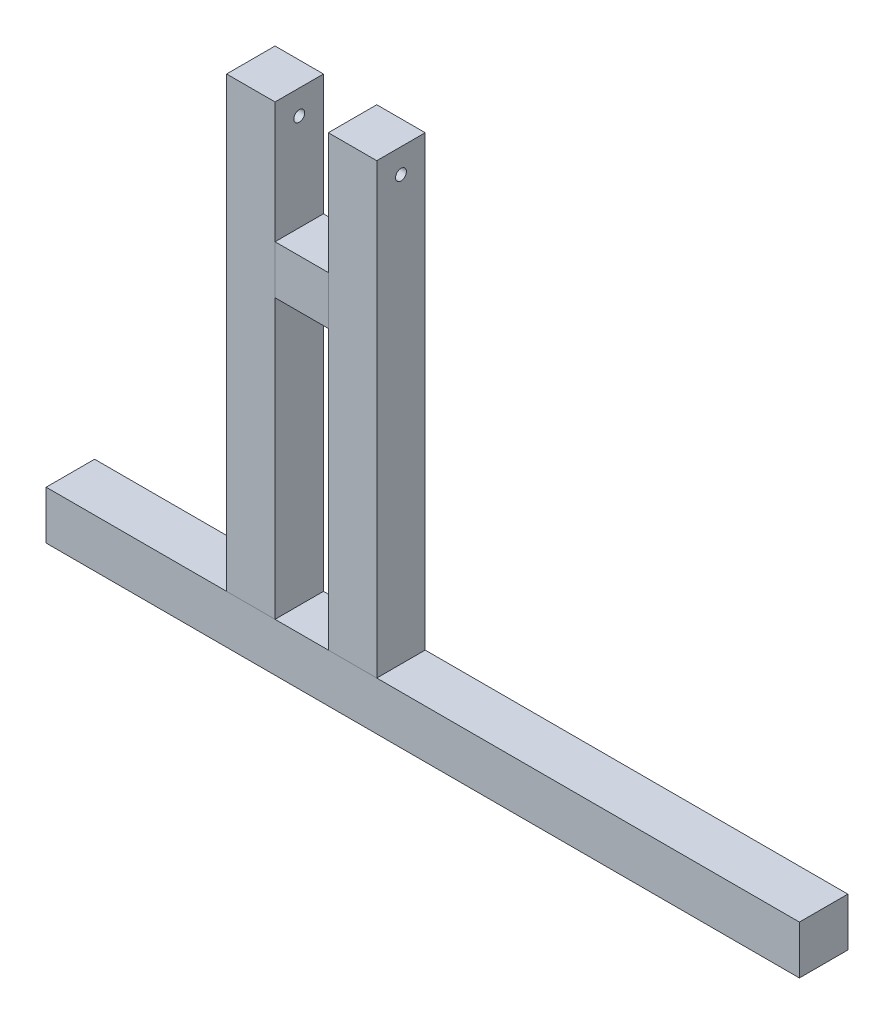
ISO-10303-21;
HEADER;
FILE_DESCRIPTION(('STEP AP214'),'2;1');
FILE_NAME('part.step','',(''),(''),'','','');
FILE_SCHEMA(('AUTOMOTIVE_DESIGN { 1 0 10303 214 1 1 1 1 }'));
ENDSEC;
DATA;
#1=APPLICATION_CONTEXT('core data for automotive mechanical design processes');
#2=APPLICATION_PROTOCOL_DEFINITION('international standard','automotive_design',2000,#1);
#3=PRODUCT_CONTEXT('',#1,'mechanical');
#4=PRODUCT('Part','Part','',(#3));
#5=PRODUCT_RELATED_PRODUCT_CATEGORY('part','',(#4));
#6=PRODUCT_DEFINITION_FORMATION('','',#4);
#7=PRODUCT_DEFINITION_CONTEXT('part definition',#1,'design');
#8=PRODUCT_DEFINITION('design','',#6,#7);
#9=PRODUCT_DEFINITION_SHAPE('','',#8);
#10=(LENGTH_UNIT() NAMED_UNIT(*) SI_UNIT(.MILLI.,.METRE.));
#11=(NAMED_UNIT(*) PLANE_ANGLE_UNIT() SI_UNIT($,.RADIAN.));
#12=(NAMED_UNIT(*) SI_UNIT($,.STERADIAN.) SOLID_ANGLE_UNIT());
#13=UNCERTAINTY_MEASURE_WITH_UNIT(LENGTH_MEASURE(1.E-05),#10,'distance_accuracy_value','');
#14=(GEOMETRIC_REPRESENTATION_CONTEXT(3) GLOBAL_UNCERTAINTY_ASSIGNED_CONTEXT((#13)) GLOBAL_UNIT_ASSIGNED_CONTEXT((#10,
#11,#12)) REPRESENTATION_CONTEXT('',''));
#15=CARTESIAN_POINT('',(0.,0.,0.));
#16=DIRECTION('',(0.,0.,1.));
#17=DIRECTION('',(1.,0.,0.));
#18=AXIS2_PLACEMENT_3D('',#15,#16,#17);
#19=CARTESIAN_POINT('',(-211.,-0.01000000000001,-20.01));
#20=DIRECTION('',(-1.,0.,0.));
#21=DIRECTION('',(0.,0.,1.));
#22=AXIS2_PLACEMENT_3D('',#19,#20,#21);
#23=PLANE('',#22);
#24=DIRECTION('',(0.,0.,1.));
#25=VECTOR('',#24,1.);
#26=CARTESIAN_POINT('',(-211.,40.,0.));
#27=LINE('',#26,#25);
#28=CARTESIAN_POINT('',(-211.,40.,-20.));
#29=VERTEX_POINT('',#28);
#30=CARTESIAN_POINT('',(-211.,40.,20.));
#31=VERTEX_POINT('',#30);
#32=EDGE_CURVE('P0_E69',#29,#31,#27,.T.);
#33=ORIENTED_EDGE('',*,*,#32,.F.);
#34=DIRECTION('',(0.,1.,0.));
#35=VECTOR('',#34,1.);
#36=CARTESIAN_POINT('',(-211.,20.,-20.));
#37=LINE('',#36,#35);
#38=CARTESIAN_POINT('',(-211.,0.,-20.));
#39=VERTEX_POINT('',#38);
#40=EDGE_CURVE('P0_E56',#39,#29,#37,.T.);
#41=ORIENTED_EDGE('',*,*,#40,.F.);
#42=DIRECTION('',(0.,0.,-1.));
#43=VECTOR('',#42,1.);
#44=CARTESIAN_POINT('',(-211.,0.,0.));
#45=LINE('',#44,#43);
#46=CARTESIAN_POINT('',(-211.,0.,20.));
#47=VERTEX_POINT('',#46);
#48=EDGE_CURVE('P0_E21',#47,#39,#45,.T.);
#49=ORIENTED_EDGE('',*,*,#48,.F.);
#50=DIRECTION('',(0.,-1.,0.));
#51=VECTOR('',#50,1.);
#52=CARTESIAN_POINT('',(-211.,20.,20.));
#53=LINE('',#52,#51);
#54=EDGE_CURVE('P0_E82',#31,#47,#53,.T.);
#55=ORIENTED_EDGE('',*,*,#54,.F.);
#56=EDGE_LOOP('',(#33,#41,#49,#55));
#57=FACE_BOUND('',#56,.T.);
#58=ADVANCED_FACE('P0_F17',(#57),#23,.T.);
#59=CARTESIAN_POINT('',(-211.01,0.,20.01));
#60=DIRECTION('',(0.,-1.,0.));
#61=DIRECTION('',(0.,0.,-1.));
#62=AXIS2_PLACEMENT_3D('',#59,#60,#61);
#63=PLANE('',#62);
#64=DIRECTION('',(1.,0.,0.));
#65=VECTOR('',#64,1.);
#66=CARTESIAN_POINT('',(100.,0.,20.));
#67=LINE('',#66,#65);
#68=CARTESIAN_POINT('',(411.,0.,20.));
#69=VERTEX_POINT('',#68);
#70=EDGE_CURVE('P0_E65',#47,#69,#67,.T.);
#71=ORIENTED_EDGE('',*,*,#70,.F.);
#72=ORIENTED_EDGE('',*,*,#48,.T.);
#73=DIRECTION('',(-1.,0.,0.));
#74=VECTOR('',#73,1.);
#75=CARTESIAN_POINT('',(100.,0.,-20.));
#76=LINE('',#75,#74);
#77=CARTESIAN_POINT('',(411.,0.,-20.));
#78=VERTEX_POINT('',#77);
#79=EDGE_CURVE('P0_E62',#78,#39,#76,.T.);
#80=ORIENTED_EDGE('',*,*,#79,.F.);
#81=DIRECTION('',(0.,0.,-1.));
#82=VECTOR('',#81,1.);
#83=CARTESIAN_POINT('',(411.,0.,0.));
#84=LINE('',#83,#82);
#85=EDGE_CURVE('P0_E84',#69,#78,#84,.T.);
#86=ORIENTED_EDGE('',*,*,#85,.F.);
#87=EDGE_LOOP('',(#71,#72,#80,#86));
#88=FACE_BOUND('',#87,.T.);
#89=ADVANCED_FACE('P0_F61',(#88),#63,.T.);
#90=CARTESIAN_POINT('',(-211.01,-0.0100000000000111,-20.));
#91=DIRECTION('',(0.,0.,-1.));
#92=DIRECTION('',(0.,1.,0.));
#93=AXIS2_PLACEMENT_3D('',#90,#91,#92);
#94=PLANE('',#93);
#95=ORIENTED_EDGE('',*,*,#79,.T.);
#96=ORIENTED_EDGE('',*,*,#40,.T.);
#97=DIRECTION('',(-1.,0.,0.));
#98=VECTOR('',#97,1.);
#99=CARTESIAN_POINT('',(100.,40.,-20.));
#100=LINE('',#99,#98);
#101=CARTESIAN_POINT('',(411.,40.,-20.));
#102=VERTEX_POINT('',#101);
#103=EDGE_CURVE('P0_E71',#102,#29,#100,.T.);
#104=ORIENTED_EDGE('',*,*,#103,.F.);
#105=DIRECTION('',(0.,1.,0.));
#106=VECTOR('',#105,1.);
#107=CARTESIAN_POINT('',(411.,20.,-20.));
#108=LINE('',#107,#106);
#109=EDGE_CURVE('P0_E75',#78,#102,#108,.T.);
#110=ORIENTED_EDGE('',*,*,#109,.F.);
#111=EDGE_LOOP('',(#95,#96,#104,#110));
#112=FACE_BOUND('',#111,.T.);
#113=ADVANCED_FACE('P0_F73',(#112),#94,.T.);
#114=CARTESIAN_POINT('',(-211.01,40.,-20.01));
#115=DIRECTION('',(0.,1.,0.));
#116=DIRECTION('',(0.,0.,1.));
#117=AXIS2_PLACEMENT_3D('',#114,#115,#116);
#118=PLANE('',#117);
#119=ORIENTED_EDGE('',*,*,#103,.T.);
#120=ORIENTED_EDGE('',*,*,#32,.T.);
#121=DIRECTION('',(-1.,0.,0.));
#122=VECTOR('',#121,1.);
#123=CARTESIAN_POINT('',(100.,40.,20.));
#124=LINE('',#123,#122);
#125=CARTESIAN_POINT('',(411.,40.,20.));
#126=VERTEX_POINT('',#125);
#127=EDGE_CURVE('P0_E36',#126,#31,#124,.T.);
#128=ORIENTED_EDGE('',*,*,#127,.F.);
#129=DIRECTION('',(0.,0.,1.));
#130=VECTOR('',#129,1.);
#131=CARTESIAN_POINT('',(411.,40.,0.));
#132=LINE('',#131,#130);
#133=EDGE_CURVE('P0_E27',#102,#126,#132,.T.);
#134=ORIENTED_EDGE('',*,*,#133,.F.);
#135=EDGE_LOOP('',(#119,#120,#128,#134));
#136=FACE_BOUND('',#135,.T.);
#137=ADVANCED_FACE('P0_F89',(#136),#118,.T.);
#138=CARTESIAN_POINT('',(-211.01,40.01,20.));
#139=DIRECTION('',(0.,0.,1.));
#140=DIRECTION('',(0.,-1.,0.));
#141=AXIS2_PLACEMENT_3D('',#138,#139,#140);
#142=PLANE('',#141);
#143=ORIENTED_EDGE('',*,*,#127,.T.);
#144=ORIENTED_EDGE('',*,*,#54,.T.);
#145=ORIENTED_EDGE('',*,*,#70,.T.);
#146=DIRECTION('',(0.,-1.,0.));
#147=VECTOR('',#146,1.);
#148=CARTESIAN_POINT('',(411.,20.,20.));
#149=LINE('',#148,#147);
#150=EDGE_CURVE('P0_E11',#126,#69,#149,.T.);
#151=ORIENTED_EDGE('',*,*,#150,.F.);
#152=EDGE_LOOP('',(#143,#144,#145,#151));
#153=FACE_BOUND('',#152,.T.);
#154=ADVANCED_FACE('P0_F91',(#153),#142,.T.);
#155=CARTESIAN_POINT('',(411.,-0.01000000000001,20.01));
#156=DIRECTION('',(1.,0.,0.));
#157=DIRECTION('',(0.,0.,-1.));
#158=AXIS2_PLACEMENT_3D('',#155,#156,#157);
#159=PLANE('',#158);
#160=ORIENTED_EDGE('',*,*,#133,.T.);
#161=ORIENTED_EDGE('',*,*,#150,.T.);
#162=ORIENTED_EDGE('',*,*,#85,.T.);
#163=ORIENTED_EDGE('',*,*,#109,.T.);
#164=EDGE_LOOP('',(#160,#161,#162,#163));
#165=FACE_BOUND('',#164,.T.);
#166=ADVANCED_FACE('P0_F19',(#165),#159,.T.);
#167=CLOSED_SHELL('',(#58,#89,#113,#137,#154,#166));
#168=MANIFOLD_SOLID_BREP('P0_B1',#167);
#169=CARTESIAN_POINT('',(21.99,40.,-20.01));
#170=DIRECTION('',(0.,-1.,0.));
#171=DIRECTION('',(1.,0.,0.));
#172=AXIS2_PLACEMENT_3D('',#169,#170,#171);
#173=PLANE('',#172);
#174=DIRECTION('',(-1.,0.,0.));
#175=VECTOR('',#174,1.);
#176=CARTESIAN_POINT('',(42.,40.,-20.));
#177=LINE('',#176,#175);
#178=CARTESIAN_POINT('',(62.,40.,-20.));
#179=VERTEX_POINT('',#178);
#180=CARTESIAN_POINT('',(22.,40.,-20.));
#181=VERTEX_POINT('',#180);
#182=EDGE_CURVE('P1_E57',#179,#181,#177,.T.);
#183=ORIENTED_EDGE('',*,*,#182,.F.);
#184=DIRECTION('',(0.,0.,-1.));
#185=VECTOR('',#184,1.);
#186=CARTESIAN_POINT('',(62.,40.,0.));
#187=LINE('',#186,#185);
#188=CARTESIAN_POINT('',(62.,40.,20.));
#189=VERTEX_POINT('',#188);
#190=EDGE_CURVE('P1_E54',#189,#179,#187,.T.);
#191=ORIENTED_EDGE('',*,*,#190,.F.);
#192=DIRECTION('',(1.,0.,0.));
#193=VECTOR('',#192,1.);
#194=CARTESIAN_POINT('',(42.,40.,20.));
#195=LINE('',#194,#193);
#196=CARTESIAN_POINT('',(22.,40.,20.));
#197=VERTEX_POINT('',#196);
#198=EDGE_CURVE('P1_E81',#197,#189,#195,.T.);
#199=ORIENTED_EDGE('',*,*,#198,.F.);
#200=DIRECTION('',(0.,0.,1.));
#201=VECTOR('',#200,1.);
#202=CARTESIAN_POINT('',(22.,40.,0.));
#203=LINE('',#202,#201);
#204=EDGE_CURVE('P1_E60',#181,#197,#203,.T.);
#205=ORIENTED_EDGE('',*,*,#204,.F.);
#206=EDGE_LOOP('',(#183,#191,#199,#205));
#207=FACE_BOUND('',#206,.T.);
#208=ADVANCED_FACE('P1_F17',(#207),#173,.T.);
#209=CARTESIAN_POINT('',(21.99,39.99,20.));
#210=DIRECTION('',(0.,0.,1.));
#211=DIRECTION('',(1.,0.,0.));
#212=AXIS2_PLACEMENT_3D('',#209,#210,#211);
#213=PLANE('',#212);
#214=DIRECTION('',(1.,0.,0.));
#215=VECTOR('',#214,1.);
#216=CARTESIAN_POINT('',(42.,410.,20.));
#217=LINE('',#216,#215);
#218=CARTESIAN_POINT('',(22.,410.,20.));
#219=VERTEX_POINT('',#218);
#220=CARTESIAN_POINT('',(62.,410.,20.));
#221=VERTEX_POINT('',#220);
#222=EDGE_CURVE('P1_E63',#219,#221,#217,.T.);
#223=ORIENTED_EDGE('',*,*,#222,.F.);
#224=DIRECTION('',(0.,1.,0.));
#225=VECTOR('',#224,1.);
#226=CARTESIAN_POINT('',(22.,225.,20.));
#227=LINE('',#226,#225);
#228=EDGE_CURVE('P1_E86',#197,#219,#227,.T.);
#229=ORIENTED_EDGE('',*,*,#228,.F.);
#230=ORIENTED_EDGE('',*,*,#198,.T.);
#231=DIRECTION('',(0.,-1.,0.));
#232=VECTOR('',#231,1.);
#233=CARTESIAN_POINT('',(62.,225.,20.));
#234=LINE('',#233,#232);
#235=EDGE_CURVE('P1_E75',#221,#189,#234,.T.);
#236=ORIENTED_EDGE('',*,*,#235,.F.);
#237=EDGE_LOOP('',(#223,#229,#230,#236));
#238=FACE_BOUND('',#237,.T.);
#239=ADVANCED_FACE('P1_F84',(#238),#213,.T.);
#240=CARTESIAN_POINT('',(21.99,410.,-20.01));
#241=DIRECTION('',(0.,1.,0.));
#242=DIRECTION('',(0.,0.,1.));
#243=AXIS2_PLACEMENT_3D('',#240,#241,#242);
#244=PLANE('',#243);
#245=DIRECTION('',(1.,0.,0.));
#246=VECTOR('',#245,1.);
#247=CARTESIAN_POINT('',(42.,410.,-20.));
#248=LINE('',#247,#246);
#249=CARTESIAN_POINT('',(22.,410.,-20.));
#250=VERTEX_POINT('',#249);
#251=CARTESIAN_POINT('',(62.,410.,-20.));
#252=VERTEX_POINT('',#251);
#253=EDGE_CURVE('P1_E34',#250,#252,#248,.T.);
#254=ORIENTED_EDGE('',*,*,#253,.F.);
#255=DIRECTION('',(0.,0.,-1.));
#256=VECTOR('',#255,1.);
#257=CARTESIAN_POINT('',(22.,410.,0.));
#258=LINE('',#257,#256);
#259=EDGE_CURVE('P1_E89',#219,#250,#258,.T.);
#260=ORIENTED_EDGE('',*,*,#259,.F.);
#261=ORIENTED_EDGE('',*,*,#222,.T.);
#262=DIRECTION('',(0.,0.,1.));
#263=VECTOR('',#262,1.);
#264=CARTESIAN_POINT('',(62.,410.,0.));
#265=LINE('',#264,#263);
#266=EDGE_CURVE('P1_E70',#252,#221,#265,.T.);
#267=ORIENTED_EDGE('',*,*,#266,.F.);
#268=EDGE_LOOP('',(#254,#260,#261,#267));
#269=FACE_BOUND('',#268,.T.);
#270=ADVANCED_FACE('P1_F96',(#269),#244,.T.);
#271=CARTESIAN_POINT('',(62.01,39.99,-20.));
#272=DIRECTION('',(0.,0.,-1.));
#273=DIRECTION('',(-1.,0.,0.));
#274=AXIS2_PLACEMENT_3D('',#271,#272,#273);
#275=PLANE('',#274);
#276=ORIENTED_EDGE('',*,*,#253,.T.);
#277=DIRECTION('',(0.,1.,0.));
#278=VECTOR('',#277,1.);
#279=CARTESIAN_POINT('',(62.,225.,-20.));
#280=LINE('',#279,#278);
#281=EDGE_CURVE('P1_E66',#179,#252,#280,.T.);
#282=ORIENTED_EDGE('',*,*,#281,.F.);
#283=ORIENTED_EDGE('',*,*,#182,.T.);
#284=DIRECTION('',(0.,-1.,0.));
#285=VECTOR('',#284,1.);
#286=CARTESIAN_POINT('',(22.,225.,-20.));
#287=LINE('',#286,#285);
#288=EDGE_CURVE('P1_E92',#250,#181,#287,.T.);
#289=ORIENTED_EDGE('',*,*,#288,.F.);
#290=EDGE_LOOP('',(#276,#282,#283,#289));
#291=FACE_BOUND('',#290,.T.);
#292=ADVANCED_FACE('P1_F67',(#291),#275,.T.);
#293=CARTESIAN_POINT('',(62.,39.99,20.01));
#294=DIRECTION('',(1.,0.,0.));
#295=DIRECTION('',(0.,0.,-1.));
#296=AXIS2_PLACEMENT_3D('',#293,#294,#295);
#297=PLANE('',#296);
#298=CARTESIAN_POINT('',(62.,390.,0.));
#299=DIRECTION('',(-1.,0.,0.));
#300=DIRECTION('',(0.,0.,1.));
#301=AXIS2_PLACEMENT_3D('',#298,#299,#300);
#302=CIRCLE('',#301,4.50000000000002);
#303=CARTESIAN_POINT('',(62.,390.,4.49999999999997));
#304=VERTEX_POINT('',#303);
#305=EDGE_CURVE('P1_E21',#304,#304,#302,.F.);
#306=ORIENTED_EDGE('',*,*,#305,.F.);
#307=EDGE_LOOP('',(#306));
#308=FACE_BOUND('',#307,.T.);
#309=ORIENTED_EDGE('',*,*,#266,.T.);
#310=ORIENTED_EDGE('',*,*,#235,.T.);
#311=ORIENTED_EDGE('',*,*,#190,.T.);
#312=ORIENTED_EDGE('',*,*,#281,.T.);
#313=EDGE_LOOP('',(#309,#310,#311,#312));
#314=FACE_BOUND('',#313,.T.);
#315=ADVANCED_FACE('P1_F73',(#308,#314),#297,.T.);
#316=CARTESIAN_POINT('',(22.,39.99,-20.01));
#317=DIRECTION('',(-1.,0.,0.));
#318=DIRECTION('',(0.,0.,1.));
#319=AXIS2_PLACEMENT_3D('',#316,#317,#318);
#320=PLANE('',#319);
#321=CARTESIAN_POINT('',(22.,390.,0.));
#322=DIRECTION('',(-1.,0.,0.));
#323=DIRECTION('',(0.,0.,1.));
#324=AXIS2_PLACEMENT_3D('',#321,#322,#323);
#325=CIRCLE('',#324,4.50000000000002);
#326=CARTESIAN_POINT('',(22.,390.,4.49999999999997));
#327=VERTEX_POINT('',#326);
#328=EDGE_CURVE('P1_E11',#327,#327,#325,.T.);
#329=ORIENTED_EDGE('',*,*,#328,.F.);
#330=EDGE_LOOP('',(#329));
#331=FACE_BOUND('',#330,.T.);
#332=ORIENTED_EDGE('',*,*,#259,.T.);
#333=ORIENTED_EDGE('',*,*,#288,.T.);
#334=ORIENTED_EDGE('',*,*,#204,.T.);
#335=ORIENTED_EDGE('',*,*,#228,.T.);
#336=EDGE_LOOP('',(#332,#333,#334,#335));
#337=FACE_BOUND('',#336,.T.);
#338=ADVANCED_FACE('P1_F91',(#331,#337),#320,.T.);
#339=CARTESIAN_POINT('',(62.,390.,0.));
#340=DIRECTION('',(-1.,0.,0.));
#341=DIRECTION('',(0.,0.,1.));
#342=AXIS2_PLACEMENT_3D('',#339,#340,#341);
#343=CYLINDRICAL_SURFACE('',#342,4.50000000000002);
#344=ORIENTED_EDGE('',*,*,#328,.T.);
#345=EDGE_LOOP('',(#344));
#346=FACE_BOUND('',#345,.T.);
#347=ORIENTED_EDGE('',*,*,#305,.T.);
#348=EDGE_LOOP('',(#347));
#349=FACE_BOUND('',#348,.T.);
#350=ADVANCED_FACE('P1_F19',(#346,#349),#343,.F.);
#351=CLOSED_SHELL('',(#208,#239,#270,#292,#315,#338,#350));
#352=MANIFOLD_SOLID_BREP('P1_B1',#351);
#353=CARTESIAN_POINT('',(-62.01,40.,-20.01));
#354=DIRECTION('',(0.,-1.,0.));
#355=DIRECTION('',(1.,0.,0.));
#356=AXIS2_PLACEMENT_3D('',#353,#354,#355);
#357=PLANE('',#356);
#358=DIRECTION('',(-1.,0.,0.));
#359=VECTOR('',#358,1.);
#360=CARTESIAN_POINT('',(-42.,40.,-20.));
#361=LINE('',#360,#359);
#362=CARTESIAN_POINT('',(-22.,40.,-20.));
#363=VERTEX_POINT('',#362);
#364=CARTESIAN_POINT('',(-62.,40.,-20.));
#365=VERTEX_POINT('',#364);
#366=EDGE_CURVE('P2_E81',#363,#365,#361,.T.);
#367=ORIENTED_EDGE('',*,*,#366,.F.);
#368=DIRECTION('',(0.,0.,-1.));
#369=VECTOR('',#368,1.);
#370=CARTESIAN_POINT('',(-22.,40.,0.));
#371=LINE('',#370,#369);
#372=CARTESIAN_POINT('',(-22.,40.,20.));
#373=VERTEX_POINT('',#372);
#374=EDGE_CURVE('P2_E60',#373,#363,#371,.T.);
#375=ORIENTED_EDGE('',*,*,#374,.F.);
#376=DIRECTION('',(1.,0.,0.));
#377=VECTOR('',#376,1.);
#378=CARTESIAN_POINT('',(-42.,40.,20.));
#379=LINE('',#378,#377);
#380=CARTESIAN_POINT('',(-62.,40.,20.));
#381=VERTEX_POINT('',#380);
#382=EDGE_CURVE('P2_E57',#381,#373,#379,.T.);
#383=ORIENTED_EDGE('',*,*,#382,.F.);
#384=DIRECTION('',(0.,0.,1.));
#385=VECTOR('',#384,1.);
#386=CARTESIAN_POINT('',(-62.,40.,0.));
#387=LINE('',#386,#385);
#388=EDGE_CURVE('P2_E54',#365,#381,#387,.T.);
#389=ORIENTED_EDGE('',*,*,#388,.F.);
#390=EDGE_LOOP('',(#367,#375,#383,#389));
#391=FACE_BOUND('',#390,.T.);
#392=ADVANCED_FACE('P2_F17',(#391),#357,.T.);
#393=CARTESIAN_POINT('',(-21.99,39.99,-20.));
#394=DIRECTION('',(0.,0.,-1.));
#395=DIRECTION('',(-1.,0.,0.));
#396=AXIS2_PLACEMENT_3D('',#393,#394,#395);
#397=PLANE('',#396);
#398=DIRECTION('',(-1.,0.,0.));
#399=VECTOR('',#398,1.);
#400=CARTESIAN_POINT('',(-42.,410.,-20.));
#401=LINE('',#400,#399);
#402=CARTESIAN_POINT('',(-22.,410.,-20.));
#403=VERTEX_POINT('',#402);
#404=CARTESIAN_POINT('',(-62.,410.,-20.));
#405=VERTEX_POINT('',#404);
#406=EDGE_CURVE('P2_E63',#403,#405,#401,.T.);
#407=ORIENTED_EDGE('',*,*,#406,.F.);
#408=DIRECTION('',(0.,1.,0.));
#409=VECTOR('',#408,1.);
#410=CARTESIAN_POINT('',(-22.,225.,-20.));
#411=LINE('',#410,#409);
#412=EDGE_CURVE('P2_E86',#363,#403,#411,.T.);
#413=ORIENTED_EDGE('',*,*,#412,.F.);
#414=ORIENTED_EDGE('',*,*,#366,.T.);
#415=DIRECTION('',(0.,-1.,0.));
#416=VECTOR('',#415,1.);
#417=CARTESIAN_POINT('',(-62.,225.,-20.));
#418=LINE('',#417,#416);
#419=EDGE_CURVE('P2_E75',#405,#365,#418,.T.);
#420=ORIENTED_EDGE('',*,*,#419,.F.);
#421=EDGE_LOOP('',(#407,#413,#414,#420));
#422=FACE_BOUND('',#421,.T.);
#423=ADVANCED_FACE('P2_F84',(#422),#397,.T.);
#424=CARTESIAN_POINT('',(-21.99,410.,20.01));
#425=DIRECTION('',(0.,1.,0.));
#426=DIRECTION('',(0.,0.,-1.));
#427=AXIS2_PLACEMENT_3D('',#424,#425,#426);
#428=PLANE('',#427);
#429=ORIENTED_EDGE('',*,*,#406,.T.);
#430=DIRECTION('',(0.,0.,-1.));
#431=VECTOR('',#430,1.);
#432=CARTESIAN_POINT('',(-62.,410.,0.));
#433=LINE('',#432,#431);
#434=CARTESIAN_POINT('',(-62.,410.,20.));
#435=VERTEX_POINT('',#434);
#436=EDGE_CURVE('P2_E70',#435,#405,#433,.T.);
#437=ORIENTED_EDGE('',*,*,#436,.F.);
#438=DIRECTION('',(-1.,0.,0.));
#439=VECTOR('',#438,1.);
#440=CARTESIAN_POINT('',(-42.,410.,20.));
#441=LINE('',#440,#439);
#442=CARTESIAN_POINT('',(-22.,410.,20.));
#443=VERTEX_POINT('',#442);
#444=EDGE_CURVE('P2_E34',#443,#435,#441,.T.);
#445=ORIENTED_EDGE('',*,*,#444,.F.);
#446=DIRECTION('',(0.,0.,1.));
#447=VECTOR('',#446,1.);
#448=CARTESIAN_POINT('',(-22.,410.,0.));
#449=LINE('',#448,#447);
#450=EDGE_CURVE('P2_E89',#403,#443,#449,.T.);
#451=ORIENTED_EDGE('',*,*,#450,.F.);
#452=EDGE_LOOP('',(#429,#437,#445,#451));
#453=FACE_BOUND('',#452,.T.);
#454=ADVANCED_FACE('P2_F96',(#453),#428,.T.);
#455=CARTESIAN_POINT('',(-62.01,39.99,20.));
#456=DIRECTION('',(0.,0.,1.));
#457=DIRECTION('',(1.,0.,0.));
#458=AXIS2_PLACEMENT_3D('',#455,#456,#457);
#459=PLANE('',#458);
#460=ORIENTED_EDGE('',*,*,#444,.T.);
#461=DIRECTION('',(0.,1.,0.));
#462=VECTOR('',#461,1.);
#463=CARTESIAN_POINT('',(-62.,225.,20.));
#464=LINE('',#463,#462);
#465=EDGE_CURVE('P2_E66',#381,#435,#464,.T.);
#466=ORIENTED_EDGE('',*,*,#465,.F.);
#467=ORIENTED_EDGE('',*,*,#382,.T.);
#468=DIRECTION('',(0.,-1.,0.));
#469=VECTOR('',#468,1.);
#470=CARTESIAN_POINT('',(-22.,225.,20.));
#471=LINE('',#470,#469);
#472=EDGE_CURVE('P2_E92',#443,#373,#471,.T.);
#473=ORIENTED_EDGE('',*,*,#472,.F.);
#474=EDGE_LOOP('',(#460,#466,#467,#473));
#475=FACE_BOUND('',#474,.T.);
#476=ADVANCED_FACE('P2_F67',(#475),#459,.T.);
#477=CARTESIAN_POINT('',(-62.,39.99,-20.01));
#478=DIRECTION('',(-1.,0.,0.));
#479=DIRECTION('',(0.,0.,1.));
#480=AXIS2_PLACEMENT_3D('',#477,#478,#479);
#481=PLANE('',#480);
#482=CARTESIAN_POINT('',(-62.,390.,0.));
#483=DIRECTION('',(-1.,0.,0.));
#484=DIRECTION('',(0.,0.,1.));
#485=AXIS2_PLACEMENT_3D('',#482,#483,#484);
#486=CIRCLE('',#485,4.50000000000002);
#487=CARTESIAN_POINT('',(-62.,390.,4.49999999999997));
#488=VERTEX_POINT('',#487);
#489=EDGE_CURVE('P2_E21',#488,#488,#486,.T.);
#490=ORIENTED_EDGE('',*,*,#489,.F.);
#491=EDGE_LOOP('',(#490));
#492=FACE_BOUND('',#491,.T.);
#493=ORIENTED_EDGE('',*,*,#436,.T.);
#494=ORIENTED_EDGE('',*,*,#419,.T.);
#495=ORIENTED_EDGE('',*,*,#388,.T.);
#496=ORIENTED_EDGE('',*,*,#465,.T.);
#497=EDGE_LOOP('',(#493,#494,#495,#496));
#498=FACE_BOUND('',#497,.T.);
#499=ADVANCED_FACE('P2_F73',(#492,#498),#481,.T.);
#500=CARTESIAN_POINT('',(-22.,39.99,20.01));
#501=DIRECTION('',(1.,0.,0.));
#502=DIRECTION('',(0.,0.,-1.));
#503=AXIS2_PLACEMENT_3D('',#500,#501,#502);
#504=PLANE('',#503);
#505=CARTESIAN_POINT('',(-22.,390.,0.));
#506=DIRECTION('',(-1.,0.,0.));
#507=DIRECTION('',(0.,0.,1.));
#508=AXIS2_PLACEMENT_3D('',#505,#506,#507);
#509=CIRCLE('',#508,4.50000000000002);
#510=CARTESIAN_POINT('',(-22.,390.,4.49999999999997));
#511=VERTEX_POINT('',#510);
#512=EDGE_CURVE('P2_E11',#511,#511,#509,.F.);
#513=ORIENTED_EDGE('',*,*,#512,.F.);
#514=EDGE_LOOP('',(#513));
#515=FACE_BOUND('',#514,.T.);
#516=ORIENTED_EDGE('',*,*,#450,.T.);
#517=ORIENTED_EDGE('',*,*,#472,.T.);
#518=ORIENTED_EDGE('',*,*,#374,.T.);
#519=ORIENTED_EDGE('',*,*,#412,.T.);
#520=EDGE_LOOP('',(#516,#517,#518,#519));
#521=FACE_BOUND('',#520,.T.);
#522=ADVANCED_FACE('P2_F91',(#515,#521),#504,.T.);
#523=CARTESIAN_POINT('',(-22.,390.,0.));
#524=DIRECTION('',(-1.,0.,0.));
#525=DIRECTION('',(0.,0.,1.));
#526=AXIS2_PLACEMENT_3D('',#523,#524,#525);
#527=CYLINDRICAL_SURFACE('',#526,4.50000000000002);
#528=ORIENTED_EDGE('',*,*,#512,.T.);
#529=EDGE_LOOP('',(#528));
#530=FACE_BOUND('',#529,.T.);
#531=ORIENTED_EDGE('',*,*,#489,.T.);
#532=EDGE_LOOP('',(#531));
#533=FACE_BOUND('',#532,.T.);
#534=ADVANCED_FACE('P2_F19',(#530,#533),#527,.F.);
#535=CLOSED_SHELL('',(#392,#423,#454,#476,#499,#522,#534));
#536=MANIFOLD_SOLID_BREP('P2_B1',#535);
#537=CARTESIAN_POINT('',(-22.01,310.01,20.));
#538=DIRECTION('',(0.,0.,1.));
#539=DIRECTION('',(0.,-1.,0.));
#540=AXIS2_PLACEMENT_3D('',#537,#538,#539);
#541=PLANE('',#540);
#542=DIRECTION('',(0.,1.,0.));
#543=VECTOR('',#542,1.);
#544=CARTESIAN_POINT('',(-22.,290.,20.));
#545=LINE('',#544,#543);
#546=CARTESIAN_POINT('',(-22.,270.,20.));
#547=VERTEX_POINT('',#546);
#548=CARTESIAN_POINT('',(-22.,310.,20.));
#549=VERTEX_POINT('',#548);
#550=EDGE_CURVE('P3_E69',#547,#549,#545,.T.);
#551=ORIENTED_EDGE('',*,*,#550,.F.);
#552=DIRECTION('',(-1.,0.,0.));
#553=VECTOR('',#552,1.);
#554=CARTESIAN_POINT('',(0.,270.,20.));
#555=LINE('',#554,#553);
#556=CARTESIAN_POINT('',(22.,270.,20.));
#557=VERTEX_POINT('',#556);
#558=EDGE_CURVE('P3_E56',#557,#547,#555,.T.);
#559=ORIENTED_EDGE('',*,*,#558,.F.);
#560=DIRECTION('',(0.,-1.,0.));
#561=VECTOR('',#560,1.);
#562=CARTESIAN_POINT('',(22.,290.,20.));
#563=LINE('',#562,#561);
#564=CARTESIAN_POINT('',(22.,310.,20.));
#565=VERTEX_POINT('',#564);
#566=EDGE_CURVE('P3_E21',#565,#557,#563,.T.);
#567=ORIENTED_EDGE('',*,*,#566,.F.);
#568=DIRECTION('',(1.,0.,0.));
#569=VECTOR('',#568,1.);
#570=CARTESIAN_POINT('',(0.,310.,20.));
#571=LINE('',#570,#569);
#572=EDGE_CURVE('P3_E82',#549,#565,#571,.T.);
#573=ORIENTED_EDGE('',*,*,#572,.F.);
#574=EDGE_LOOP('',(#551,#559,#567,#573));
#575=FACE_BOUND('',#574,.T.);
#576=ADVANCED_FACE('P3_F17',(#575),#541,.T.);
#577=CARTESIAN_POINT('',(22.,269.99,20.01));
#578=DIRECTION('',(1.,0.,0.));
#579=DIRECTION('',(0.,0.,-1.));
#580=AXIS2_PLACEMENT_3D('',#577,#578,#579);
#581=PLANE('',#580);
#582=DIRECTION('',(0.,0.,1.));
#583=VECTOR('',#582,1.);
#584=CARTESIAN_POINT('',(22.,270.,0.));
#585=LINE('',#584,#583);
#586=CARTESIAN_POINT('',(22.,270.,-20.));
#587=VERTEX_POINT('',#586);
#588=EDGE_CURVE('P3_E62',#587,#557,#585,.T.);
#589=ORIENTED_EDGE('',*,*,#588,.F.);
#590=DIRECTION('',(0.,-1.,0.));
#591=VECTOR('',#590,1.);
#592=CARTESIAN_POINT('',(22.,290.,-20.));
#593=LINE('',#592,#591);
#594=CARTESIAN_POINT('',(22.,310.,-20.));
#595=VERTEX_POINT('',#594);
#596=EDGE_CURVE('P3_E84',#595,#587,#593,.T.);
#597=ORIENTED_EDGE('',*,*,#596,.F.);
#598=DIRECTION('',(0.,0.,-1.));
#599=VECTOR('',#598,1.);
#600=CARTESIAN_POINT('',(22.,310.,0.));
#601=LINE('',#600,#599);
#602=EDGE_CURVE('P3_E65',#565,#595,#601,.T.);
#603=ORIENTED_EDGE('',*,*,#602,.F.);
#604=ORIENTED_EDGE('',*,*,#566,.T.);
#605=EDGE_LOOP('',(#589,#597,#603,#604));
#606=FACE_BOUND('',#605,.T.);
#607=ADVANCED_FACE('P3_F61',(#606),#581,.T.);
#608=CARTESIAN_POINT('',(-22.01,270.,20.01));
#609=DIRECTION('',(0.,-1.,0.));
#610=DIRECTION('',(0.,0.,-1.));
#611=AXIS2_PLACEMENT_3D('',#608,#609,#610);
#612=PLANE('',#611);
#613=DIRECTION('',(0.,0.,1.));
#614=VECTOR('',#613,1.);
#615=CARTESIAN_POINT('',(-22.,270.,0.));
#616=LINE('',#615,#614);
#617=CARTESIAN_POINT('',(-22.,270.,-20.));
#618=VERTEX_POINT('',#617);
#619=EDGE_CURVE('P3_E71',#618,#547,#616,.T.);
#620=ORIENTED_EDGE('',*,*,#619,.F.);
#621=DIRECTION('',(-1.,0.,0.));
#622=VECTOR('',#621,1.);
#623=CARTESIAN_POINT('',(0.,270.,-20.));
#624=LINE('',#623,#622);
#625=EDGE_CURVE('P3_E75',#587,#618,#624,.T.);
#626=ORIENTED_EDGE('',*,*,#625,.F.);
#627=ORIENTED_EDGE('',*,*,#588,.T.);
#628=ORIENTED_EDGE('',*,*,#558,.T.);
#629=EDGE_LOOP('',(#620,#626,#627,#628));
#630=FACE_BOUND('',#629,.T.);
#631=ADVANCED_FACE('P3_F73',(#630),#612,.T.);
#632=CARTESIAN_POINT('',(-22.,269.99,-20.01));
#633=DIRECTION('',(-1.,0.,0.));
#634=DIRECTION('',(0.,0.,1.));
#635=AXIS2_PLACEMENT_3D('',#632,#633,#634);
#636=PLANE('',#635);
#637=DIRECTION('',(0.,0.,1.));
#638=VECTOR('',#637,1.);
#639=CARTESIAN_POINT('',(-22.,310.,0.));
#640=LINE('',#639,#638);
#641=CARTESIAN_POINT('',(-22.,310.,-20.));
#642=VERTEX_POINT('',#641);
#643=EDGE_CURVE('P3_E36',#642,#549,#640,.T.);
#644=ORIENTED_EDGE('',*,*,#643,.F.);
#645=DIRECTION('',(0.,1.,0.));
#646=VECTOR('',#645,1.);
#647=CARTESIAN_POINT('',(-22.,290.,-20.));
#648=LINE('',#647,#646);
#649=EDGE_CURVE('P3_E27',#618,#642,#648,.T.);
#650=ORIENTED_EDGE('',*,*,#649,.F.);
#651=ORIENTED_EDGE('',*,*,#619,.T.);
#652=ORIENTED_EDGE('',*,*,#550,.T.);
#653=EDGE_LOOP('',(#644,#650,#651,#652));
#654=FACE_BOUND('',#653,.T.);
#655=ADVANCED_FACE('P3_F89',(#654),#636,.T.);
#656=CARTESIAN_POINT('',(-22.01,310.,-20.01));
#657=DIRECTION('',(0.,1.,0.));
#658=DIRECTION('',(0.,0.,1.));
#659=AXIS2_PLACEMENT_3D('',#656,#657,#658);
#660=PLANE('',#659);
#661=ORIENTED_EDGE('',*,*,#643,.T.);
#662=ORIENTED_EDGE('',*,*,#572,.T.);
#663=ORIENTED_EDGE('',*,*,#602,.T.);
#664=DIRECTION('',(1.,0.,0.));
#665=VECTOR('',#664,1.);
#666=CARTESIAN_POINT('',(0.,310.,-20.));
#667=LINE('',#666,#665);
#668=EDGE_CURVE('P3_E11',#642,#595,#667,.T.);
#669=ORIENTED_EDGE('',*,*,#668,.F.);
#670=EDGE_LOOP('',(#661,#662,#663,#669));
#671=FACE_BOUND('',#670,.T.);
#672=ADVANCED_FACE('P3_F91',(#671),#660,.T.);
#673=CARTESIAN_POINT('',(-22.01,269.99,-20.));
#674=DIRECTION('',(0.,0.,-1.));
#675=DIRECTION('',(0.,1.,0.));
#676=AXIS2_PLACEMENT_3D('',#673,#674,#675);
#677=PLANE('',#676);
#678=ORIENTED_EDGE('',*,*,#649,.T.);
#679=ORIENTED_EDGE('',*,*,#668,.T.);
#680=ORIENTED_EDGE('',*,*,#596,.T.);
#681=ORIENTED_EDGE('',*,*,#625,.T.);
#682=EDGE_LOOP('',(#678,#679,#680,#681));
#683=FACE_BOUND('',#682,.T.);
#684=ADVANCED_FACE('P3_F19',(#683),#677,.T.);
#685=CLOSED_SHELL('',(#576,#607,#631,#655,#672,#684));
#686=MANIFOLD_SOLID_BREP('P3_B1',#685);
#687=ADVANCED_BREP_SHAPE_REPRESENTATION('',(#18,#168,#352,#536,#686),#14);
#688=SHAPE_DEFINITION_REPRESENTATION(#9,#687);
ENDSEC;
END-ISO-10303-21;
